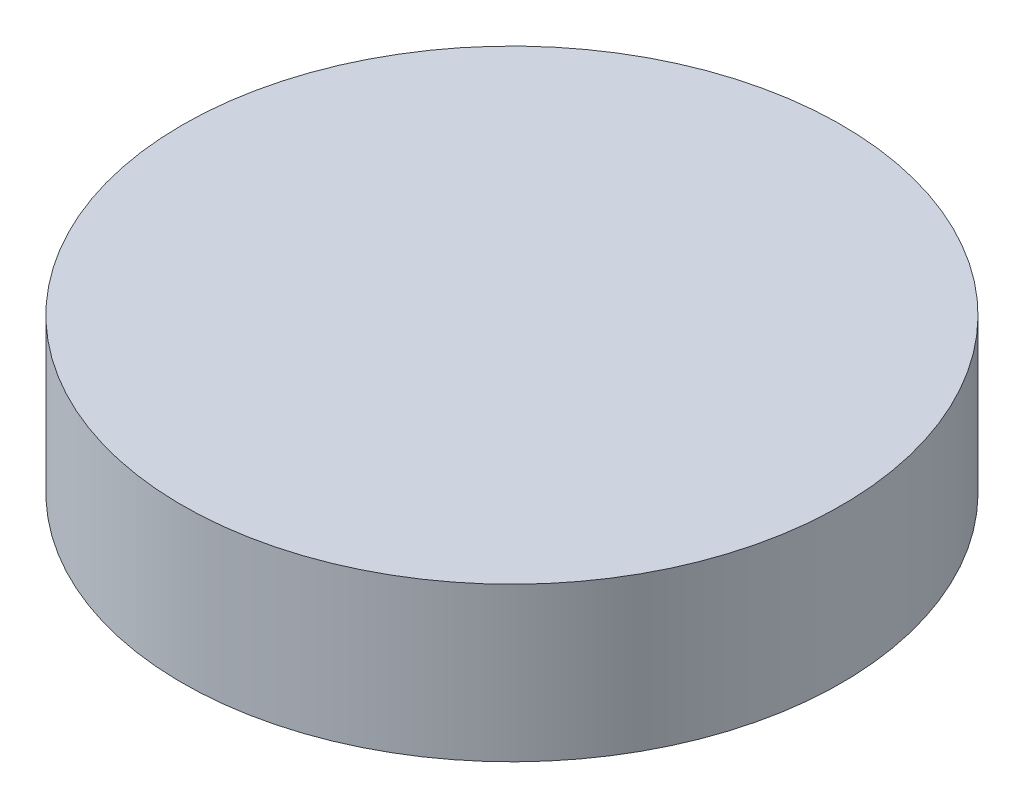
ISO-10303-21;
HEADER;
FILE_DESCRIPTION(('STEP AP214'),'2;1');
FILE_NAME('part.step','',(''),(''),'','','');
FILE_SCHEMA(('AUTOMOTIVE_DESIGN { 1 0 10303 214 1 1 1 1 }'));
ENDSEC;
DATA;
#1=APPLICATION_CONTEXT('core data for automotive mechanical design processes');
#2=APPLICATION_PROTOCOL_DEFINITION('international standard','automotive_design',2000,#1);
#3=PRODUCT_CONTEXT('',#1,'mechanical');
#4=PRODUCT('Part','Part','',(#3));
#5=PRODUCT_RELATED_PRODUCT_CATEGORY('part','',(#4));
#6=PRODUCT_DEFINITION_FORMATION('','',#4);
#7=PRODUCT_DEFINITION_CONTEXT('part definition',#1,'design');
#8=PRODUCT_DEFINITION('design','',#6,#7);
#9=PRODUCT_DEFINITION_SHAPE('','',#8);
#10=(LENGTH_UNIT() NAMED_UNIT(*) SI_UNIT(.MILLI.,.METRE.));
#11=(NAMED_UNIT(*) PLANE_ANGLE_UNIT() SI_UNIT($,.RADIAN.));
#12=(NAMED_UNIT(*) SI_UNIT($,.STERADIAN.) SOLID_ANGLE_UNIT());
#13=UNCERTAINTY_MEASURE_WITH_UNIT(LENGTH_MEASURE(1.E-05),#10,'distance_accuracy_value','');
#14=(GEOMETRIC_REPRESENTATION_CONTEXT(3) GLOBAL_UNCERTAINTY_ASSIGNED_CONTEXT((#13)) GLOBAL_UNIT_ASSIGNED_CONTEXT((#10,
#11,#12)) REPRESENTATION_CONTEXT('',''));
#15=CARTESIAN_POINT('',(0.,0.,0.));
#16=DIRECTION('',(0.,0.,1.));
#17=DIRECTION('',(1.,0.,0.));
#18=AXIS2_PLACEMENT_3D('',#15,#16,#17);
#19=CARTESIAN_POINT('',(0.,1.42,0.));
#20=DIRECTION('',(0.,-1.,0.));
#21=DIRECTION('',(0.,0.,-1.));
#22=AXIS2_PLACEMENT_3D('',#19,#20,#21);
#23=PLANE('',#22);
#24=CARTESIAN_POINT('',(-0.425061033199,1.42,-1.075061033199));
#25=DIRECTION('',(0.,-1.,0.));
#26=DIRECTION('',(-1.,0.,0.));
#27=AXIS2_PLACEMENT_3D('',#24,#25,#26);
#28=CIRCLE('',#27,0.15);
#29=CARTESIAN_POINT('',(-0.575061033199,1.42,-1.075061033199));
#30=VERTEX_POINT('',#29);
#31=EDGE_CURVE('E10',#30,#30,#28,.T.);
#32=ORIENTED_EDGE('',*,*,#31,.F.);
#33=EDGE_LOOP('',(#32));
#34=FACE_BOUND('',#33,.T.);
#35=ADVANCED_FACE('F15',(#34),#23,.F.);
#36=CARTESIAN_POINT('',(-0.425061033199,0.925735931288,-1.075061033199));
#37=DIRECTION('',(0.,1.,0.));
#38=DIRECTION('',(-1.,0.,0.));
#39=AXIS2_PLACEMENT_3D('',#36,#37,#38);
#40=CYLINDRICAL_SURFACE('',#39,0.15);
#41=CARTESIAN_POINT('',(-0.425061033199,1.35,-1.075061033199));
#42=DIRECTION('',(0.,-1.,0.));
#43=DIRECTION('',(-1.,0.,0.));
#44=AXIS2_PLACEMENT_3D('',#41,#42,#43);
#45=CIRCLE('',#44,0.15);
#46=CARTESIAN_POINT('',(-0.575061033199,1.35,-1.075061033199));
#47=VERTEX_POINT('',#46);
#48=EDGE_CURVE('E19',#47,#47,#45,.T.);
#49=ORIENTED_EDGE('',*,*,#48,.F.);
#50=EDGE_LOOP('',(#49));
#51=FACE_BOUND('',#50,.T.);
#52=ORIENTED_EDGE('',*,*,#31,.T.);
#53=EDGE_LOOP('',(#52));
#54=FACE_BOUND('',#53,.T.);
#55=ADVANCED_FACE('F29',(#51,#54),#40,.T.);
#56=CARTESIAN_POINT('',(-0.425061033199,1.35,-1.075061033199));
#57=DIRECTION('',(0.,1.,0.));
#58=DIRECTION('',(-1.,0.,0.));
#59=AXIS2_PLACEMENT_3D('',#56,#57,#58);
#60=PLANE('',#59);
#61=ORIENTED_EDGE('',*,*,#48,.T.);
#62=EDGE_LOOP('',(#61));
#63=FACE_BOUND('',#62,.T.);
#64=ADVANCED_FACE('F17',(#63),#60,.F.);
#65=CLOSED_SHELL('',(#35,#55,#64));
#66=MANIFOLD_SOLID_BREP('B1',#65);
#67=ADVANCED_BREP_SHAPE_REPRESENTATION('',(#18,#66),#14);
#68=SHAPE_DEFINITION_REPRESENTATION(#9,#67);
ENDSEC;
END-ISO-10303-21;
